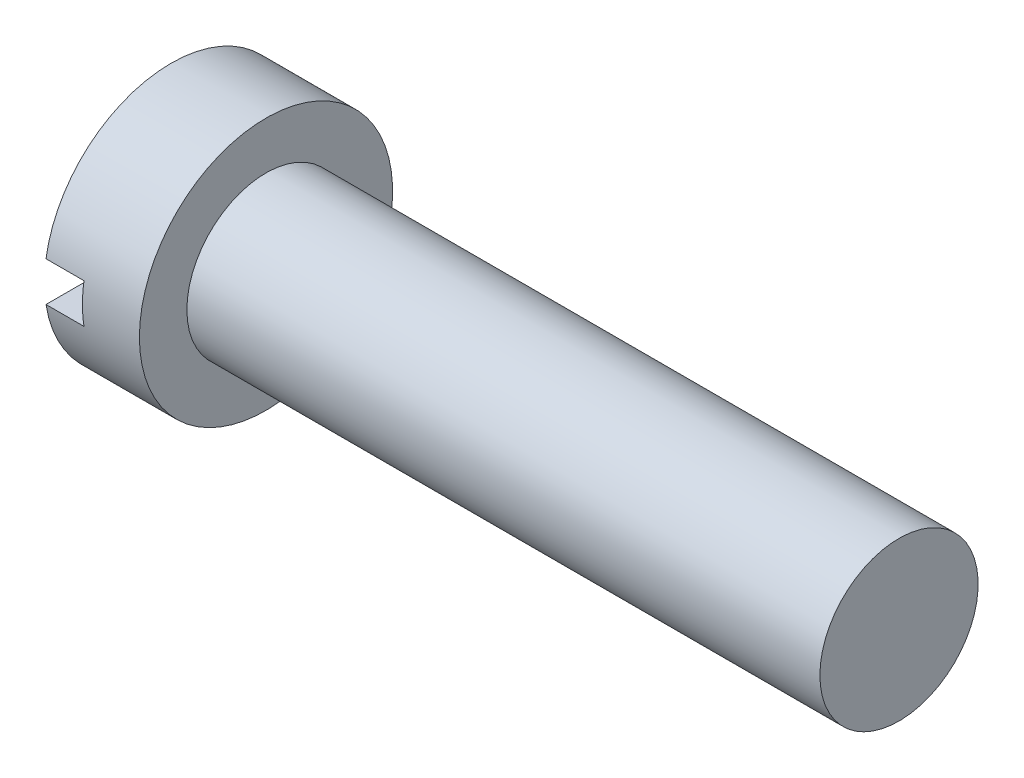
ISO-10303-21;
HEADER;
FILE_DESCRIPTION(('STEP AP214'),'2;1');
FILE_NAME('part.step','',(''),(''),'','','');
FILE_SCHEMA(('AUTOMOTIVE_DESIGN { 1 0 10303 214 1 1 1 1 }'));
ENDSEC;
DATA;
#1=APPLICATION_CONTEXT('core data for automotive mechanical design processes');
#2=APPLICATION_PROTOCOL_DEFINITION('international standard','automotive_design',2000,#1);
#3=PRODUCT_CONTEXT('',#1,'mechanical');
#4=PRODUCT('Part','Part','',(#3));
#5=PRODUCT_RELATED_PRODUCT_CATEGORY('part','',(#4));
#6=PRODUCT_DEFINITION_FORMATION('','',#4);
#7=PRODUCT_DEFINITION_CONTEXT('part definition',#1,'design');
#8=PRODUCT_DEFINITION('design','',#6,#7);
#9=PRODUCT_DEFINITION_SHAPE('','',#8);
#10=(LENGTH_UNIT() NAMED_UNIT(*) SI_UNIT(.MILLI.,.METRE.));
#11=(NAMED_UNIT(*) PLANE_ANGLE_UNIT() SI_UNIT($,.RADIAN.));
#12=(NAMED_UNIT(*) SI_UNIT($,.STERADIAN.) SOLID_ANGLE_UNIT());
#13=UNCERTAINTY_MEASURE_WITH_UNIT(LENGTH_MEASURE(1.E-05),#10,'distance_accuracy_value','');
#14=(GEOMETRIC_REPRESENTATION_CONTEXT(3) GLOBAL_UNCERTAINTY_ASSIGNED_CONTEXT((#13)) GLOBAL_UNIT_ASSIGNED_CONTEXT((#10,
#11,#12)) REPRESENTATION_CONTEXT('',''));
#15=CARTESIAN_POINT('',(0.,0.,0.));
#16=DIRECTION('',(0.,0.,1.));
#17=DIRECTION('',(1.,0.,0.));
#18=AXIS2_PLACEMENT_3D('',#15,#16,#17);
#19=CARTESIAN_POINT('',(0.,0.,0.));
#20=DIRECTION('',(-1.,0.,0.));
#21=DIRECTION('',(0.,0.,1.));
#22=AXIS2_PLACEMENT_3D('',#19,#20,#21);
#23=PLANE('',#22);
#24=DIRECTION('',(0.,0.,-1.));
#25=VECTOR('',#24,1.);
#26=CARTESIAN_POINT('',(0.,1.25,8.));
#27=LINE('',#26,#25);
#28=CARTESIAN_POINT('',(0.,1.25,7.90174031463955));
#29=VERTEX_POINT('',#28);
#30=CARTESIAN_POINT('',(0.,1.25,-7.90174031463955));
#31=VERTEX_POINT('',#30);
#32=EDGE_CURVE('E90',#29,#31,#27,.T.);
#33=ORIENTED_EDGE('',*,*,#32,.F.);
#34=CARTESIAN_POINT('',(0.,0.,0.));
#35=DIRECTION('',(-1.,0.,0.));
#36=DIRECTION('',(0.,0.,1.));
#37=AXIS2_PLACEMENT_3D('',#34,#35,#36);
#38=CIRCLE('',#37,8.);
#39=EDGE_CURVE('E96',#29,#31,#38,.T.);
#40=ORIENTED_EDGE('',*,*,#39,.T.);
#41=EDGE_LOOP('',(#33,#40));
#42=FACE_BOUND('',#41,.T.);
#43=ADVANCED_FACE('F38',(#42),#23,.T.);
#44=CARTESIAN_POINT('',(-25.4,0.,0.));
#45=DIRECTION('',(-1.,0.,0.));
#46=DIRECTION('',(0.,0.,1.));
#47=AXIS2_PLACEMENT_3D('',#44,#45,#46);
#48=CYLINDRICAL_SURFACE('',#47,5.);
#49=CARTESIAN_POINT('',(46.,0.,0.));
#50=DIRECTION('',(-1.,0.,0.));
#51=DIRECTION('',(0.,0.,1.));
#52=AXIS2_PLACEMENT_3D('',#49,#50,#51);
#53=CIRCLE('',#52,5.);
#54=CARTESIAN_POINT('',(46.,0.,5.));
#55=VERTEX_POINT('',#54);
#56=EDGE_CURVE('E100',#55,#55,#53,.T.);
#57=ORIENTED_EDGE('',*,*,#56,.T.);
#58=EDGE_LOOP('',(#57));
#59=FACE_BOUND('',#58,.T.);
#60=CARTESIAN_POINT('',(6.,0.,0.));
#61=DIRECTION('',(-1.,0.,0.));
#62=DIRECTION('',(0.,0.,1.));
#63=AXIS2_PLACEMENT_3D('',#60,#61,#62);
#64=CIRCLE('',#63,5.);
#65=CARTESIAN_POINT('',(6.,0.,5.));
#66=VERTEX_POINT('',#65);
#67=EDGE_CURVE('E102',#66,#66,#64,.T.);
#68=ORIENTED_EDGE('',*,*,#67,.F.);
#69=EDGE_LOOP('',(#68));
#70=FACE_BOUND('',#69,.T.);
#71=ADVANCED_FACE('F40',(#59,#70),#48,.T.);
#72=CARTESIAN_POINT('',(46.,5.,0.));
#73=DIRECTION('',(1.,0.,0.));
#74=DIRECTION('',(0.,0.,-1.));
#75=AXIS2_PLACEMENT_3D('',#72,#73,#74);
#76=PLANE('',#75);
#77=ORIENTED_EDGE('',*,*,#56,.F.);
#78=EDGE_LOOP('',(#77));
#79=FACE_BOUND('',#78,.T.);
#80=ADVANCED_FACE('F139',(#79),#76,.T.);
#81=DIRECTION('',(0.,0.,1.));
#82=VECTOR('',#81,1.);
#83=CARTESIAN_POINT('',(0.,-1.25,-8.));
#84=LINE('',#83,#82);
#85=CARTESIAN_POINT('',(0.,-1.25,-7.90174031463955));
#86=VERTEX_POINT('',#85);
#87=CARTESIAN_POINT('',(0.,-1.25,7.90174031463955));
#88=VERTEX_POINT('',#87);
#89=EDGE_CURVE('E82',#86,#88,#84,.T.);
#90=ORIENTED_EDGE('',*,*,#89,.F.);
#91=EDGE_CURVE('E88',#86,#88,#38,.T.);
#92=ORIENTED_EDGE('',*,*,#91,.T.);
#93=EDGE_LOOP('',(#90,#92));
#94=FACE_BOUND('',#93,.T.);
#95=ADVANCED_FACE('F87',(#94),#23,.T.);
#96=CARTESIAN_POINT('',(-25.4,0.,0.));
#97=DIRECTION('',(-1.,0.,0.));
#98=DIRECTION('',(0.,0.,1.));
#99=AXIS2_PLACEMENT_3D('',#96,#97,#98);
#100=CYLINDRICAL_SURFACE('',#99,8.);
#101=DIRECTION('',(-1.,0.,0.));
#102=VECTOR('',#101,1.);
#103=CARTESIAN_POINT('',(-25.4,1.25,-7.90174031463955));
#104=LINE('',#103,#102);
#105=CARTESIAN_POINT('',(2.4,1.25,-7.90174031463955));
#106=VERTEX_POINT('',#105);
#107=EDGE_CURVE('E11',#31,#106,#104,.F.);
#108=ORIENTED_EDGE('',*,*,#107,.F.);
#109=ORIENTED_EDGE('',*,*,#39,.F.);
#110=DIRECTION('',(-1.,0.,0.));
#111=VECTOR('',#110,1.);
#112=CARTESIAN_POINT('',(-25.4,1.25,7.90174031463955));
#113=LINE('',#112,#111);
#114=CARTESIAN_POINT('',(2.4,1.25,7.90174031463955));
#115=VERTEX_POINT('',#114);
#116=EDGE_CURVE('E110',#115,#29,#113,.T.);
#117=ORIENTED_EDGE('',*,*,#116,.F.);
#118=CARTESIAN_POINT('',(2.4,0.,0.));
#119=DIRECTION('',(-1.,0.,0.));
#120=DIRECTION('',(0.,0.,1.));
#121=AXIS2_PLACEMENT_3D('',#118,#119,#120);
#122=CIRCLE('',#121,8.);
#123=CARTESIAN_POINT('',(2.4,-1.25,7.90174031463955));
#124=VERTEX_POINT('',#123);
#125=EDGE_CURVE('E53',#115,#124,#122,.F.);
#126=ORIENTED_EDGE('',*,*,#125,.T.);
#127=DIRECTION('',(-1.,0.,0.));
#128=VECTOR('',#127,1.);
#129=CARTESIAN_POINT('',(-25.4,-1.25,7.90174031463955));
#130=LINE('',#129,#128);
#131=EDGE_CURVE('E95',#88,#124,#130,.F.);
#132=ORIENTED_EDGE('',*,*,#131,.F.);
#133=ORIENTED_EDGE('',*,*,#91,.F.);
#134=DIRECTION('',(-1.,0.,0.));
#135=VECTOR('',#134,1.);
#136=CARTESIAN_POINT('',(-25.4,-1.25,-7.90174031463955));
#137=LINE('',#136,#135);
#138=CARTESIAN_POINT('',(2.4,-1.25,-7.90174031463955));
#139=VERTEX_POINT('',#138);
#140=EDGE_CURVE('E46',#139,#86,#137,.T.);
#141=ORIENTED_EDGE('',*,*,#140,.F.);
#142=EDGE_CURVE('E61',#139,#106,#122,.F.);
#143=ORIENTED_EDGE('',*,*,#142,.T.);
#144=EDGE_LOOP('',(#108,#109,#117,#126,#132,#133,#141,#143));
#145=FACE_BOUND('',#144,.T.);
#146=CARTESIAN_POINT('',(6.,0.,0.));
#147=DIRECTION('',(-1.,0.,0.));
#148=DIRECTION('',(0.,0.,1.));
#149=AXIS2_PLACEMENT_3D('',#146,#147,#148);
#150=CIRCLE('',#149,8.);
#151=CARTESIAN_POINT('',(6.,0.,8.));
#152=VERTEX_POINT('',#151);
#153=EDGE_CURVE('E97',#152,#152,#150,.T.);
#154=ORIENTED_EDGE('',*,*,#153,.T.);
#155=EDGE_LOOP('',(#154));
#156=FACE_BOUND('',#155,.T.);
#157=ADVANCED_FACE('F93',(#145,#156),#100,.T.);
#158=CARTESIAN_POINT('',(6.,5.,0.));
#159=DIRECTION('',(-1.,0.,0.));
#160=DIRECTION('',(0.,0.,1.));
#161=AXIS2_PLACEMENT_3D('',#158,#159,#160);
#162=PLANE('',#161);
#163=ORIENTED_EDGE('',*,*,#153,.F.);
#164=EDGE_LOOP('',(#163));
#165=FACE_BOUND('',#164,.T.);
#166=ORIENTED_EDGE('',*,*,#67,.T.);
#167=EDGE_LOOP('',(#166));
#168=FACE_BOUND('',#167,.T.);
#169=ADVANCED_FACE('F125',(#165,#168),#162,.F.);
#170=CARTESIAN_POINT('',(2.4,1.25,8.));
#171=DIRECTION('',(0.,1.,0.));
#172=DIRECTION('',(0.,0.,1.));
#173=AXIS2_PLACEMENT_3D('',#170,#171,#172);
#174=PLANE('',#173);
#175=ORIENTED_EDGE('',*,*,#107,.T.);
#176=DIRECTION('',(0.,0.,-1.));
#177=VECTOR('',#176,1.);
#178=CARTESIAN_POINT('',(2.4,1.25,8.));
#179=LINE('',#178,#177);
#180=EDGE_CURVE('E89',#115,#106,#179,.T.);
#181=ORIENTED_EDGE('',*,*,#180,.F.);
#182=ORIENTED_EDGE('',*,*,#116,.T.);
#183=ORIENTED_EDGE('',*,*,#32,.T.);
#184=EDGE_LOOP('',(#175,#181,#182,#183));
#185=FACE_BOUND('',#184,.T.);
#186=ADVANCED_FACE('F123',(#185),#174,.F.);
#187=CARTESIAN_POINT('',(2.4,-1.25,-8.));
#188=DIRECTION('',(0.,-1.,0.));
#189=DIRECTION('',(0.,0.,-1.));
#190=AXIS2_PLACEMENT_3D('',#187,#188,#189);
#191=PLANE('',#190);
#192=ORIENTED_EDGE('',*,*,#131,.T.);
#193=DIRECTION('',(0.,0.,1.));
#194=VECTOR('',#193,1.);
#195=CARTESIAN_POINT('',(2.4,-1.25,-8.));
#196=LINE('',#195,#194);
#197=EDGE_CURVE('E83',#139,#124,#196,.T.);
#198=ORIENTED_EDGE('',*,*,#197,.F.);
#199=ORIENTED_EDGE('',*,*,#140,.T.);
#200=ORIENTED_EDGE('',*,*,#89,.T.);
#201=EDGE_LOOP('',(#192,#198,#199,#200));
#202=FACE_BOUND('',#201,.T.);
#203=ADVANCED_FACE('F81',(#202),#191,.F.);
#204=CARTESIAN_POINT('',(2.4,1.25,-8.));
#205=DIRECTION('',(-1.,0.,0.));
#206=DIRECTION('',(0.,0.,1.));
#207=AXIS2_PLACEMENT_3D('',#204,#205,#206);
#208=PLANE('',#207);
#209=ORIENTED_EDGE('',*,*,#197,.T.);
#210=ORIENTED_EDGE('',*,*,#125,.F.);
#211=ORIENTED_EDGE('',*,*,#180,.T.);
#212=ORIENTED_EDGE('',*,*,#142,.F.);
#213=EDGE_LOOP('',(#209,#210,#211,#212));
#214=FACE_BOUND('',#213,.T.);
#215=ADVANCED_FACE('F122',(#214),#208,.T.);
#216=CLOSED_SHELL('',(#43,#71,#80,#95,#157,#169,#186,#203,#215));
#217=MANIFOLD_SOLID_BREP('B2',#216);
#218=ADVANCED_BREP_SHAPE_REPRESENTATION('',(#18,#217),#14);
#219=SHAPE_DEFINITION_REPRESENTATION(#9,#218);
ENDSEC;
END-ISO-10303-21;
